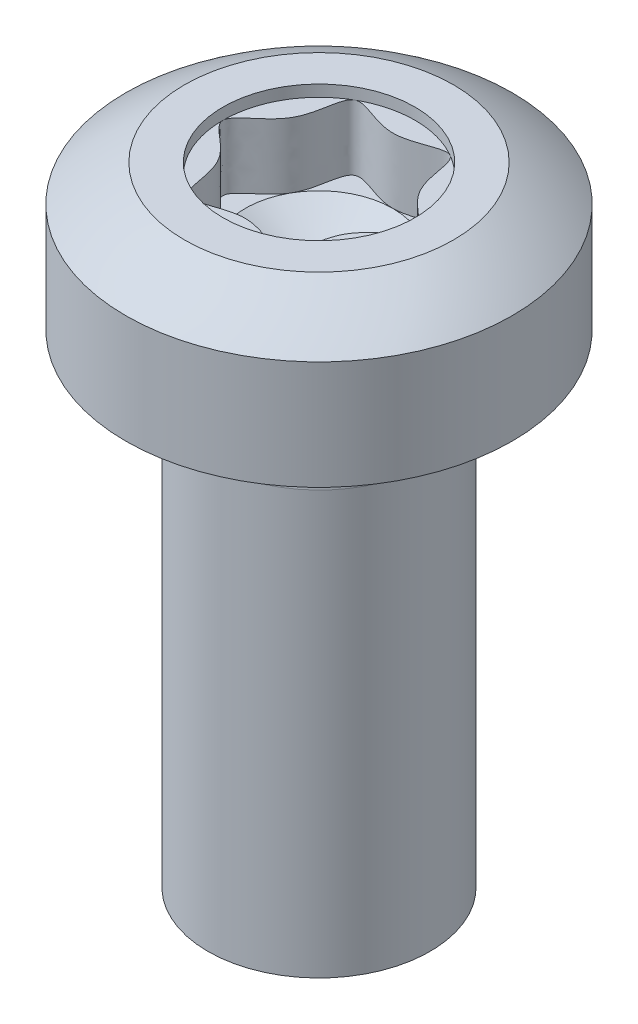
ISO-10303-21;
HEADER;
FILE_DESCRIPTION(('STEP AP214'),'2;1');
FILE_NAME('part.step','',(''),(''),'','','');
FILE_SCHEMA(('AUTOMOTIVE_DESIGN { 1 0 10303 214 1 1 1 1 }'));
ENDSEC;
DATA;
#1=APPLICATION_CONTEXT('core data for automotive mechanical design processes');
#2=APPLICATION_PROTOCOL_DEFINITION('international standard','automotive_design',2000,#1);
#3=PRODUCT_CONTEXT('',#1,'mechanical');
#4=PRODUCT('Part','Part','',(#3));
#5=PRODUCT_RELATED_PRODUCT_CATEGORY('part','',(#4));
#6=PRODUCT_DEFINITION_FORMATION('','',#4);
#7=PRODUCT_DEFINITION_CONTEXT('part definition',#1,'design');
#8=PRODUCT_DEFINITION('design','',#6,#7);
#9=PRODUCT_DEFINITION_SHAPE('','',#8);
#10=(LENGTH_UNIT() NAMED_UNIT(*) SI_UNIT(.MILLI.,.METRE.));
#11=(NAMED_UNIT(*) PLANE_ANGLE_UNIT() SI_UNIT($,.RADIAN.));
#12=(NAMED_UNIT(*) SI_UNIT($,.STERADIAN.) SOLID_ANGLE_UNIT());
#13=UNCERTAINTY_MEASURE_WITH_UNIT(LENGTH_MEASURE(1.E-05),#10,'distance_accuracy_value','');
#14=(GEOMETRIC_REPRESENTATION_CONTEXT(3) GLOBAL_UNCERTAINTY_ASSIGNED_CONTEXT((#13)) GLOBAL_UNIT_ASSIGNED_CONTEXT((#10,
#11,#12)) REPRESENTATION_CONTEXT('',''));
#15=CARTESIAN_POINT('',(0.,0.,0.));
#16=DIRECTION('',(0.,0.,1.));
#17=DIRECTION('',(1.,0.,0.));
#18=AXIS2_PLACEMENT_3D('',#15,#16,#17);
#19=CARTESIAN_POINT('',(0.,0.,0.));
#20=DIRECTION('',(0.,-1.,0.));
#21=DIRECTION('',(0.,0.,-1.));
#22=AXIS2_PLACEMENT_3D('',#19,#20,#21);
#23=CYLINDRICAL_SURFACE('',#22,8.);
#24=CARTESIAN_POINT('',(0.,20.,0.));
#25=DIRECTION('',(0.,-1.,0.));
#26=DIRECTION('',(0.,0.,-1.));
#27=AXIS2_PLACEMENT_3D('',#24,#25,#26);
#28=CIRCLE('',#27,8.);
#29=CARTESIAN_POINT('',(0.,20.,-8.));
#30=VERTEX_POINT('',#29);
#31=EDGE_CURVE('E152',#30,#30,#28,.T.);
#32=ORIENTED_EDGE('',*,*,#31,.F.);
#33=EDGE_LOOP('',(#32));
#34=FACE_BOUND('',#33,.T.);
#35=CARTESIAN_POINT('',(0.,24.5,0.));
#36=DIRECTION('',(0.,-1.,0.));
#37=DIRECTION('',(0.,0.,-1.));
#38=AXIS2_PLACEMENT_3D('',#35,#36,#37);
#39=CIRCLE('',#38,8.);
#40=CARTESIAN_POINT('',(8.,24.5,0.));
#41=VERTEX_POINT('',#40);
#42=EDGE_CURVE('E157',#41,#41,#39,.T.);
#43=ORIENTED_EDGE('',*,*,#42,.T.);
#44=EDGE_LOOP('',(#43));
#45=FACE_BOUND('',#44,.T.);
#46=ADVANCED_FACE('F36',(#34,#45),#23,.T.);
#47=CARTESIAN_POINT('',(4.6,20.,0.));
#48=DIRECTION('',(0.,-1.,0.));
#49=DIRECTION('',(0.,0.,-1.));
#50=AXIS2_PLACEMENT_3D('',#47,#48,#49);
#51=PLANE('',#50);
#52=ORIENTED_EDGE('',*,*,#31,.T.);
#53=EDGE_LOOP('',(#52));
#54=FACE_BOUND('',#53,.T.);
#55=CARTESIAN_POINT('',(0.,20.,0.));
#56=DIRECTION('',(0.,-1.,0.));
#57=DIRECTION('',(0.,0.,-1.));
#58=AXIS2_PLACEMENT_3D('',#55,#56,#57);
#59=CIRCLE('',#58,4.6);
#60=CARTESIAN_POINT('',(0.,20.,-4.6));
#61=VERTEX_POINT('',#60);
#62=EDGE_CURVE('E349',#61,#61,#59,.T.);
#63=ORIENTED_EDGE('',*,*,#62,.F.);
#64=EDGE_LOOP('',(#63));
#65=FACE_BOUND('',#64,.T.);
#66=ADVANCED_FACE('F318',(#54,#65),#51,.T.);
#67=CARTESIAN_POINT('',(0.,14.2530492340404,0.));
#68=DIRECTION('',(0.,-1.,0.));
#69=DIRECTION('',(1.,0.,0.));
#70=AXIS2_PLACEMENT_3D('',#67,#68,#69);
#71=SPHERICAL_SURFACE('',#70,13.);
#72=CARTESIAN_POINT('',(0.,26.,0.));
#73=DIRECTION('',(0.,1.,0.));
#74=DIRECTION('',(0.,0.,1.));
#75=AXIS2_PLACEMENT_3D('',#72,#73,#74);
#76=CIRCLE('',#75,5.56858579013749);
#77=CARTESIAN_POINT('',(5.56858579013749,26.,0.));
#78=VERTEX_POINT('',#77);
#79=EDGE_CURVE('E161',#78,#78,#76,.T.);
#80=CARTESIAN_POINT('',(8.,24.5,0.));
#81=CARTESIAN_POINT('',(7.97649554592093,24.5183504009738,0.));
#82=CARTESIAN_POINT('',(7.95292795153097,24.5366199274566,0.));
#83=CARTESIAN_POINT('',(7.90566760281113,24.5729963723878,0.));
#84=CARTESIAN_POINT('',(7.88197484848123,24.591103290836,0.));
#85=CARTESIAN_POINT('',(7.83446530056333,24.6271536606453,0.));
#86=CARTESIAN_POINT('',(7.81064850697533,24.6450971120062,0.));
#87=CARTESIAN_POINT('',(7.76289200868479,24.6808196983919,0.));
#88=CARTESIAN_POINT('',(7.73895230398225,24.6985988334167,0.));
#89=CARTESIAN_POINT('',(7.69095111700099,24.7339919451095,0.));
#90=CARTESIAN_POINT('',(7.66688963472226,24.7516059217774,0.));
#91=CARTESIAN_POINT('',(7.61864603200755,24.7866678827048,0.));
#92=CARTESIAN_POINT('',(7.59446391157157,24.8041158669641,0.));
#93=CARTESIAN_POINT('',(7.54598017764338,24.8388450168433,0.));
#94=CARTESIAN_POINT('',(7.52167856415117,24.856126182463,0.));
#95=CARTESIAN_POINT('',(7.47295699487816,24.8905208767417,0.));
#96=CARTESIAN_POINT('',(7.44853703909735,24.9076344054007,0.));
#97=CARTESIAN_POINT('',(7.39957994161648,24.9416930153723,0.));
#98=CARTESIAN_POINT('',(7.37504279991643,24.9586380966849,0.));
#99=CARTESIAN_POINT('',(7.32585249251616,24.9923590095554,0.));
#100=CARTESIAN_POINT('',(7.30119932681595,25.0091348411132,0.));
#101=CARTESIAN_POINT('',(7.25177813882847,25.0425164600802,0.));
#102=CARTESIAN_POINT('',(7.22701011654119,25.0591222474893,0.));
#103=CARTESIAN_POINT('',(7.17736038823154,25.092162991817,0.));
#104=CARTESIAN_POINT('',(7.15247868220918,25.1085979487356,0.));
#105=CARTESIAN_POINT('',(7.10260276466465,25.1412962538299,0.));
#106=CARTESIAN_POINT('',(7.07760855314249,25.1575596020056,0.));
#107=CARTESIAN_POINT('',(7.02750880816119,25.1899139194881,0.));
#108=CARTESIAN_POINT('',(7.00240327470206,25.2060048887949,0.));
#109=CARTESIAN_POINT('',(6.95208207468111,25.2380136865762,0.));
#110=CARTESIAN_POINT('',(6.9268664081193,25.2539315150506,0.));
#111=CARTESIAN_POINT('',(6.87632613594249,25.2855932774028,0.));
#112=CARTESIAN_POINT('',(6.85100153032749,25.3013372112805,0.));
#113=CARTESIAN_POINT('',(6.80024457925243,25.332650438909,0.));
#114=CARTESIAN_POINT('',(6.77481223379238,25.3482197326598,0.));
#115=CARTESIAN_POINT('',(6.72384100733719,25.3791829427744,0.));
#116=CARTESIAN_POINT('',(6.69830212634206,25.3945768591382,0.));
#117=CARTESIAN_POINT('',(6.64711903817153,25.4251885855234,0.));
#118=CARTESIAN_POINT('',(6.62147483099614,25.4404063955447,0.));
#119=CARTESIAN_POINT('',(6.57008230480747,25.4706651886286,0.));
#120=CARTESIAN_POINT('',(6.54433398579419,25.4857061716912,0.));
#121=CARTESIAN_POINT('',(6.49273445520218,25.5156105986149,0.));
#122=CARTESIAN_POINT('',(6.46688324362345,25.530474042476,0.));
#123=CARTESIAN_POINT('',(6.41507915204529,25.5600226871608,0.));
#124=CARTESIAN_POINT('',(6.38912627204586,25.5747078879846,0.));
#125=CARTESIAN_POINT('',(6.3371200725854,25.6038993511995,0.));
#126=CARTESIAN_POINT('',(6.31106675312437,25.6184056135907,0.));
#127=CARTESIAN_POINT('',(6.25886090845599,25.6472385130185,0.));
#128=CARTESIAN_POINT('',(6.23270838324865,25.6615651500551,0.));
#129=CARTESIAN_POINT('',(6.18030536550055,25.6900381203575,0.));
#130=CARTESIAN_POINT('',(6.15405487295981,25.7041844536233,0.));
#131=CARTESIAN_POINT('',(6.10145716359734,25.7322961465067,0.));
#132=CARTESIAN_POINT('',(6.07510994677562,25.7462615061244,0.));
#133=CARTESIAN_POINT('',(6.02232003648229,25.7740105904006,0.));
#134=CARTESIAN_POINT('',(5.99587734301068,25.7877943150591,0.));
#135=CARTESIAN_POINT('',(5.94289773157567,25.8151794767194,0.));
#136=CARTESIAN_POINT('',(5.91636081361225,25.8287809137211,0.));
#137=CARTESIAN_POINT('',(5.86319400979179,25.8558008559568,0.));
#138=CARTESIAN_POINT('',(5.83656412393474,25.8692193611908,0.));
#139=CARTESIAN_POINT('',(5.78321264540874,25.895872804611,0.));
#140=CARTESIAN_POINT('',(5.75649105273981,25.9091077427971,0.));
#141=CARTESIAN_POINT('',(5.70295742571127,25.9353934249057,0.));
#142=CARTESIAN_POINT('',(5.67614539135167,25.9484441688281,0.));
#143=CARTESIAN_POINT('',(5.62243215147719,25.9743608462606,0.));
#144=CARTESIAN_POINT('',(5.59553094596231,25.9872267797706,0.));
#145=CARTESIAN_POINT('',(5.56858579013749,26.,0.));
#146=B_SPLINE_CURVE_WITH_KNOTS('',3,(#80,#81,#82,#83,#84,#85,#86,#87,#88,#89,#90,#91,#92,#93,
#94,#95,#96,#97,#98,#99,#100,#101,#102,#103,#104,#105,#106,#107,#108,#109,#110,#111,#112,#113,
#114,#115,#116,#117,#118,#119,#120,#121,#122,#123,#124,#125,#126,#127,#128,#129,#130,#131,#132,
#133,#134,#135,#136,#137,#138,#139,#140,#141,#142,#143,#144,#145),.UNSPECIFIED.,.F.,.F.,(4,2,2,
2,2,2,2,2,2,2,2,2,2,2,2,2,2,2,2,2,2,2,2,2,2,2,2,2,2,2,2,2,4),(0.,0.0894580215008651,
0.178916043001729,0.268374064502595,0.35783208600346,0.447290107504326,0.53674812900519,
0.626206150506057,0.715664172006922,0.805122193507789,0.894580215008655,0.98403823650952,
1.07349625801039,1.16295427951125,1.25241230101212,1.34187032251298,1.43132834401385,
1.52078636551471,1.61024438701558,1.69970240851645,1.78916043001731,1.87861845151818,
1.96807647301904,2.05753449451991,2.14699251602077,2.23645053752164,2.32590855902251,
2.41536658052337,2.50482460202424,2.5942826235251,2.68374064502597,2.77319866652683,
2.8626566880277),.UNSPECIFIED.);
#147=EDGE_CURVE('BSEAM324',#41,#78,#146,.T.);
#148=ORIENTED_EDGE('',*,*,#42,.F.);
#149=ORIENTED_EDGE('',*,*,#79,.F.);
#150=ORIENTED_EDGE('',*,*,#147,.T.);
#151=ORIENTED_EDGE('',*,*,#147,.F.);
#152=EDGE_LOOP('',(#148,#150,#149,#151));
#153=FACE_BOUND('',#152,.T.);
#154=ADVANCED_FACE('F324',(#153),#71,.T.);
#155=CARTESIAN_POINT('',(8.,26.,0.));
#156=DIRECTION('',(0.,1.,0.));
#157=DIRECTION('',(0.,0.,1.));
#158=AXIS2_PLACEMENT_3D('',#155,#156,#157);
#159=PLANE('',#158);
#160=CARTESIAN_POINT('',(0.,26.,0.));
#161=DIRECTION('',(0.,1.,0.));
#162=DIRECTION('',(0.,0.,1.));
#163=AXIS2_PLACEMENT_3D('',#160,#161,#162);
#164=CIRCLE('',#163,3.975);
#165=CARTESIAN_POINT('',(0.,26.,3.975));
#166=VERTEX_POINT('',#165);
#167=EDGE_CURVE('E369',#166,#166,#164,.T.);
#168=ORIENTED_EDGE('',*,*,#167,.F.);
#169=EDGE_LOOP('',(#168));
#170=FACE_BOUND('',#169,.T.);
#171=ORIENTED_EDGE('',*,*,#79,.T.);
#172=EDGE_LOOP('',(#171));
#173=FACE_BOUND('',#172,.T.);
#174=ADVANCED_FACE('F330',(#170,#173),#159,.T.);
#175=CARTESIAN_POINT('',(0.,17.5,0.));
#176=DIRECTION('',(0.,-1.,0.));
#177=DIRECTION('',(0.,0.,-1.));
#178=AXIS2_PLACEMENT_3D('',#175,#176,#177);
#179=CONICAL_SURFACE('',#178,4.6,0.104396870067181);
#180=CARTESIAN_POINT('',(0.,19.6,0.));
#181=DIRECTION('',(0.,-1.,0.));
#182=DIRECTION('',(0.,0.,-1.));
#183=AXIS2_PLACEMENT_3D('',#180,#181,#182);
#184=CIRCLE('',#183,4.37996663175755);
#185=CARTESIAN_POINT('',(0.,19.6,-4.37996663175755));
#186=VERTEX_POINT('',#185);
#187=EDGE_CURVE('E346',#186,#186,#184,.T.);
#188=ORIENTED_EDGE('',*,*,#187,.T.);
#189=EDGE_LOOP('',(#188));
#190=FACE_BOUND('',#189,.T.);
#191=CARTESIAN_POINT('',(0.,17.5,0.));
#192=DIRECTION('',(0.,-1.,0.));
#193=DIRECTION('',(0.,0.,-1.));
#194=AXIS2_PLACEMENT_3D('',#191,#192,#193);
#195=CIRCLE('',#194,4.6);
#196=CARTESIAN_POINT('',(0.,17.5,-4.6));
#197=VERTEX_POINT('',#196);
#198=EDGE_CURVE('E164',#197,#197,#195,.T.);
#199=ORIENTED_EDGE('',*,*,#198,.F.);
#200=EDGE_LOOP('',(#199));
#201=FACE_BOUND('',#200,.T.);
#202=ADVANCED_FACE('F360',(#190,#201),#179,.T.);
#203=CARTESIAN_POINT('',(0.,19.641682936628,0.));
#204=DIRECTION('',(0.,-1.,0.));
#205=DIRECTION('',(0.,0.,-1.));
#206=AXIS2_PLACEMENT_3D('',#203,#204,#205);
#207=TOROIDAL_SURFACE('',#206,4.77778886943923,0.399999999999999);
#208=ORIENTED_EDGE('',*,*,#62,.T.);
#209=EDGE_LOOP('',(#208));
#210=FACE_BOUND('',#209,.T.);
#211=ORIENTED_EDGE('',*,*,#187,.F.);
#212=EDGE_LOOP('',(#211));
#213=FACE_BOUND('',#212,.T.);
#214=ADVANCED_FACE('F341',(#210,#213),#207,.F.);
#215=CARTESIAN_POINT('',(0.,0.,0.));
#216=DIRECTION('',(0.,-1.,0.));
#217=DIRECTION('',(0.,0.,-1.));
#218=AXIS2_PLACEMENT_3D('',#215,#216,#217);
#219=PLANE('',#218);
#220=CARTESIAN_POINT('',(0.,0.,0.));
#221=DIRECTION('',(0.,-1.,0.));
#222=DIRECTION('',(0.,0.,-1.));
#223=AXIS2_PLACEMENT_3D('',#220,#221,#222);
#224=CIRCLE('',#223,4.6);
#225=CARTESIAN_POINT('',(0.,0.,-4.6));
#226=VERTEX_POINT('',#225);
#227=EDGE_CURVE('E147',#226,#226,#224,.T.);
#228=ORIENTED_EDGE('',*,*,#227,.T.);
#229=EDGE_LOOP('',(#228));
#230=FACE_BOUND('',#229,.T.);
#231=ADVANCED_FACE('F38',(#230),#219,.T.);
#232=CARTESIAN_POINT('',(0.,0.,0.));
#233=DIRECTION('',(0.,-1.,0.));
#234=DIRECTION('',(0.,0.,-1.));
#235=AXIS2_PLACEMENT_3D('',#232,#233,#234);
#236=CYLINDRICAL_SURFACE('',#235,4.6);
#237=ORIENTED_EDGE('',*,*,#227,.F.);
#238=EDGE_LOOP('',(#237));
#239=FACE_BOUND('',#238,.T.);
#240=ORIENTED_EDGE('',*,*,#198,.T.);
#241=EDGE_LOOP('',(#240));
#242=FACE_BOUND('',#241,.T.);
#243=ADVANCED_FACE('F332',(#239,#242),#236,.T.);
#244=CARTESIAN_POINT('',(0.,25.523,0.));
#245=DIRECTION('',(0.,1.,0.));
#246=DIRECTION('',(0.,0.,1.));
#247=AXIS2_PLACEMENT_3D('',#244,#245,#246);
#248=CYLINDRICAL_SURFACE('',#247,3.975);
#249=ORIENTED_EDGE('',*,*,#167,.T.);
#250=EDGE_LOOP('',(#249));
#251=FACE_BOUND('',#250,.T.);
#252=CARTESIAN_POINT('',(0.,25.523,0.));
#253=DIRECTION('',(0.,1.,0.));
#254=DIRECTION('',(0.,0.,1.));
#255=AXIS2_PLACEMENT_3D('',#252,#253,#254);
#256=CIRCLE('',#255,3.975);
#257=CARTESIAN_POINT('',(-1.98749999999998,25.523,3.44245098004315));
#258=VERTEX_POINT('',#257);
#259=CARTESIAN_POINT('',(1.98750000000002,25.523,3.44245098004313));
#260=VERTEX_POINT('',#259);
#261=EDGE_CURVE('E128',#258,#260,#256,.T.);
#262=ORIENTED_EDGE('',*,*,#261,.F.);
#263=CARTESIAN_POINT('',(-3.975,25.523,0.));
#264=VERTEX_POINT('',#263);
#265=EDGE_CURVE('E370',#264,#258,#256,.T.);
#266=ORIENTED_EDGE('',*,*,#265,.F.);
#267=CARTESIAN_POINT('',(-1.98750000000002,25.523,-3.44245098004313));
#268=VERTEX_POINT('',#267);
#269=EDGE_CURVE('E372',#268,#264,#256,.T.);
#270=ORIENTED_EDGE('',*,*,#269,.F.);
#271=CARTESIAN_POINT('',(1.98749999999998,25.523,-3.44245098004315));
#272=VERTEX_POINT('',#271);
#273=EDGE_CURVE('E121',#272,#268,#256,.T.);
#274=ORIENTED_EDGE('',*,*,#273,.F.);
#275=CARTESIAN_POINT('',(3.975,25.523,0.));
#276=VERTEX_POINT('',#275);
#277=EDGE_CURVE('E111',#276,#272,#256,.T.);
#278=ORIENTED_EDGE('',*,*,#277,.F.);
#279=EDGE_CURVE('E54',#260,#276,#256,.T.);
#280=ORIENTED_EDGE('',*,*,#279,.F.);
#281=EDGE_LOOP('',(#262,#266,#270,#274,#278,#280));
#282=FACE_BOUND('',#281,.T.);
#283=ADVANCED_FACE('F118',(#251,#282),#248,.F.);
#284=CARTESIAN_POINT('',(0.,25.523,0.));
#285=DIRECTION('',(0.,1.,0.));
#286=DIRECTION('',(0.,0.,1.));
#287=AXIS2_PLACEMENT_3D('',#284,#285,#286);
#288=PLANE('',#287);
#289=CARTESIAN_POINT('',(0.,25.523,3.05769230769231));
#290=CARTESIAN_POINT('',(0.815686274551115,25.523,3.0576923076923));
#291=CARTESIAN_POINT('',(2.44705882365334,25.523,4.23843021167727));
#292=CARTESIAN_POINT('',(2.13676470538672,25.523,1.2336616778499));
#293=CARTESIAN_POINT('',(4.89411764730665,25.523,0.));
#294=CARTESIAN_POINT('',(2.13676470538671,25.523,-1.23366167784992));
#295=CARTESIAN_POINT('',(2.4470588236533,25.523,-4.2384302116773));
#296=CARTESIAN_POINT('',(0.,25.523,-2.46732335569982));
#297=CARTESIAN_POINT('',(-2.44705882365334,25.523,-4.23843021167727));
#298=CARTESIAN_POINT('',(-2.13676470538671,25.523,-1.23366167784991));
#299=CARTESIAN_POINT('',(-4.89411764730665,25.523,0.));
#300=CARTESIAN_POINT('',(-2.13676470538671,25.523,1.23366167784992));
#301=CARTESIAN_POINT('',(-2.4470588236533,25.523,4.2384302116773));
#302=CARTESIAN_POINT('',(-0.815686274551101,25.523,3.05769230769231));
#303=CARTESIAN_POINT('',(0.,25.523,3.05769230769231));
#304=B_SPLINE_CURVE_WITH_KNOTS('',3,(#289,#290,#291,#292,#293,#294,#295,#296,#297,#298,#299,
#300,#301,#302,#303),.UNSPECIFIED.,.T.,.F.,(4,1,1,1,1,1,1,1,1,1,1,1,4),(0.,0.0833333333333341,
0.166666666666667,0.250000000000001,0.333333333333333,0.416666666666667,0.5,0.583333333333334,
0.666666666666667,0.750000000000001,0.833333333333333,0.916666666666667,1.),.UNSPECIFIED.);
#305=EDGE_CURVE('E11',#258,#264,#304,.F.);
#306=ORIENTED_EDGE('',*,*,#305,.T.);
#307=ORIENTED_EDGE('',*,*,#265,.T.);
#308=EDGE_LOOP('',(#306,#307));
#309=FACE_BOUND('',#308,.T.);
#310=ADVANCED_FACE('F339',(#309),#288,.T.);
#311=EDGE_CURVE('E47',#264,#268,#304,.F.);
#312=ORIENTED_EDGE('',*,*,#311,.T.);
#313=ORIENTED_EDGE('',*,*,#269,.T.);
#314=EDGE_LOOP('',(#312,#313));
#315=FACE_BOUND('',#314,.T.);
#316=ADVANCED_FACE('F380',(#315),#288,.T.);
#317=EDGE_CURVE('E115',#268,#272,#304,.F.);
#318=ORIENTED_EDGE('',*,*,#317,.T.);
#319=ORIENTED_EDGE('',*,*,#273,.T.);
#320=EDGE_LOOP('',(#318,#319));
#321=FACE_BOUND('',#320,.T.);
#322=ADVANCED_FACE('F379',(#321),#288,.T.);
#323=EDGE_CURVE('E109',#272,#276,#304,.F.);
#324=ORIENTED_EDGE('',*,*,#323,.T.);
#325=ORIENTED_EDGE('',*,*,#277,.T.);
#326=EDGE_LOOP('',(#324,#325));
#327=FACE_BOUND('',#326,.T.);
#328=ADVANCED_FACE('F110',(#327),#288,.T.);
#329=EDGE_CURVE('E116',#276,#260,#304,.F.);
#330=ORIENTED_EDGE('',*,*,#329,.T.);
#331=ORIENTED_EDGE('',*,*,#279,.T.);
#332=EDGE_LOOP('',(#330,#331));
#333=FACE_BOUND('',#332,.T.);
#334=ADVANCED_FACE('F125',(#333),#288,.T.);
#335=EDGE_CURVE('E40',#260,#258,#304,.F.);
#336=ORIENTED_EDGE('',*,*,#335,.T.);
#337=ORIENTED_EDGE('',*,*,#261,.T.);
#338=EDGE_LOOP('',(#336,#337));
#339=FACE_BOUND('',#338,.T.);
#340=ADVANCED_FACE('F387',(#339),#288,.T.);
#341=CARTESIAN_POINT('',(0.,22.82,0.));
#342=DIRECTION('',(0.,1.,0.));
#343=DIRECTION('',(0.,0.,1.));
#344=AXIS2_PLACEMENT_3D('',#341,#342,#343);
#345=PLANE('',#344);
#346=CARTESIAN_POINT('',(0.,22.82,0.));
#347=DIRECTION('',(0.,1.,0.));
#348=DIRECTION('',(0.881549013507512,0.,0.472092508714057));
#349=AXIS2_PLACEMENT_3D('',#346,#347,#348);
#350=CIRCLE('',#349,3.05769230769231);
#351=CARTESIAN_POINT('',(2.69787028997874,22.82,1.44503035522741));
#352=VERTEX_POINT('',#351);
#353=CARTESIAN_POINT('',(2.66196984233389,22.82,-1.50636268887187));
#354=VERTEX_POINT('',#353);
#355=EDGE_CURVE('E141',#352,#354,#350,.T.);
#356=ORIENTED_EDGE('',*,*,#355,.F.);
#357=CARTESIAN_POINT('',(2.66143561437564,22.82,-1.50605289266838));
#358=CARTESIAN_POINT('',(3.07563558349557,22.82,-0.813555364317623));
#359=CARTESIAN_POINT('',(4.84797612069008,22.82,-0.0119352840856501));
#360=CARTESIAN_POINT('',(3.127637914832,22.82,0.789684796146351));
#361=CARTESIAN_POINT('',(2.69911285713381,22.82,1.44582778906239));
#362=B_SPLINE_CURVE_WITH_KNOTS('',3,(#357,#358,#359,#360,#361),.UNSPECIFIED.,.F.,.F.,(4,1,4),
(0.169985680603832,0.252418670430459,0.332432989826627),.UNSPECIFIED.);
#363=EDGE_CURVE('E285',#352,#354,#362,.F.);
#364=ORIENTED_EDGE('',*,*,#363,.T.);
#365=EDGE_LOOP('',(#356,#364));
#366=FACE_BOUND('',#365,.T.);
#367=ADVANCED_FACE('F185',(#366),#345,.T.);
#368=CARTESIAN_POINT('',(-0.000781045270946759,22.82,-3.05769182891709));
#369=CARTESIAN_POINT('',(0.803471751431939,22.82,-3.05790406492198));
#370=CARTESIAN_POINT('',(1.50552662167113,22.82,-2.66182162507648));
#371=CARTESIAN_POINT('',(2.20446517718511,22.82,-2.26749733490277));
#372=CARTESIAN_POINT('',(2.61945189050329,22.82,-1.57834900704314));
#373=B_SPLINE_CURVE_WITH_KNOTS('',2,(#368,#369,#370,#371,#372),.UNSPECIFIED.,.F.,.F.,(3,2,3),
(0.,0.5,1.),.UNSPECIFIED.);
#374=CARTESIAN_POINT('',(0.000742424595345002,22.82,-3.05769240122321));
#375=VERTEX_POINT('',#374);
#376=CARTESIAN_POINT('',(2.61790523262918,22.82,-1.58319739929965));
#377=VERTEX_POINT('',#376);
#378=EDGE_CURVE('E127',#375,#377,#373,.T.);
#379=ORIENTED_EDGE('',*,*,#378,.T.);
#380=CARTESIAN_POINT('',(0.000155057807458628,22.82,-3.05769231480316));
#381=CARTESIAN_POINT('',(0.815789644577634,22.82,-3.05776712191756));
#382=CARTESIAN_POINT('',(2.4245783828942,22.82,-4.22210163825064));
#383=CARTESIAN_POINT('',(2.24554690407833,22.82,-2.28984070371147));
#384=CARTESIAN_POINT('',(2.61547131244174,22.82,-1.58788657339917));
#385=B_SPLINE_CURVE_WITH_KNOTS('',3,(#380,#381,#382,#383,#384),.UNSPECIFIED.,.F.,.F.,(4,1,4),
(0.335629425376625,0.418957478295838,0.49999471958588),.UNSPECIFIED.);
#386=EDGE_CURVE('E282',#377,#375,#385,.F.);
#387=ORIENTED_EDGE('',*,*,#386,.T.);
#388=EDGE_LOOP('',(#379,#387));
#389=FACE_BOUND('',#388,.T.);
#390=ADVANCED_FACE('F174',(#389),#345,.T.);
#391=CARTESIAN_POINT('',(0.,22.82,0.));
#392=DIRECTION('',(0.,1.,0.));
#393=DIRECTION('',(0.000242805543424307,0.,-0.999999970522734));
#394=AXIS2_PLACEMENT_3D('',#391,#392,#393);
#395=CIRCLE('',#394,3.05769230769231);
#396=CARTESIAN_POINT('',(-2.66629658817147,22.82,-1.49898600467109));
#397=VERTEX_POINT('',#396);
#398=EDGE_CURVE('E144',#375,#397,#395,.T.);
#399=ORIENTED_EDGE('',*,*,#398,.F.);
#400=CARTESIAN_POINT('',(-2.66588064145487,22.82,-1.49866293028352));
#401=CARTESIAN_POINT('',(-2.65983134375439,22.82,-1.50866398460531));
#402=CARTESIAN_POINT('',(-2.23871411155985,22.82,-2.22090039646527));
#403=CARTESIAN_POINT('',(-2.44705882365334,22.82,-4.23843021167727));
#404=CARTESIAN_POINT('',(-0.815634588615256,22.82,-3.0576548989817));
#405=CARTESIAN_POINT('',(0.000103371871717009,22.82,-3.05769231006271));
#406=CARTESIAN_POINT('',(0.000155057807458682,22.82,-3.05769231480316));
#407=B_SPLINE_CURVE_WITH_KNOTS('',3,(#400,#401,#402,#403,#404,#405,#406),.UNSPECIFIED.,.F.,.F.,
(4,1,1,1,4),(0.49999471958588,0.501188721095386,0.584522054428719,0.667855387762053,
0.667860668176173),.UNSPECIFIED.);
#408=EDGE_CURVE('E284',#375,#397,#407,.F.);
#409=ORIENTED_EDGE('',*,*,#408,.T.);
#410=EDGE_LOOP('',(#399,#409));
#411=FACE_BOUND('',#410,.T.);
#412=ADVANCED_FACE('F184',(#411),#345,.T.);
#413=CARTESIAN_POINT('',(0.,22.82,0.));
#414=DIRECTION('',(0.,1.,0.));
#415=DIRECTION('',(-0.881552782837556,0.,-0.472085470091339));
#416=AXIS2_PLACEMENT_3D('',#413,#414,#415);
#417=CIRCLE('',#416,3.05769230769231);
#418=CARTESIAN_POINT('',(-2.69788261585195,22.82,-1.44500938708784));
#419=VERTEX_POINT('',#418);
#420=CARTESIAN_POINT('',(-2.66196984233368,22.82,1.50636268887227));
#421=VERTEX_POINT('',#420);
#422=EDGE_CURVE('E131',#419,#421,#417,.T.);
#423=ORIENTED_EDGE('',*,*,#422,.F.);
#424=CARTESIAN_POINT('',(-2.66143561437541,22.82,1.50605289266877));
#425=CARTESIAN_POINT('',(-3.07563558349524,22.82,0.813555364317773));
#426=CARTESIAN_POINT('',(-4.84796710262063,22.82,0.0119393629100453));
#427=CARTESIAN_POINT('',(-3.12765542168154,22.82,-0.789676638497712));
#428=CARTESIAN_POINT('',(-2.69912613759267,22.82,-1.44580745476446));
#429=B_SPLINE_CURVE_WITH_KNOTS('',3,(#424,#425,#426,#427,#428),.UNSPECIFIED.,.F.,.F.,(4,1,4),
(0.669986507172492,0.752419496999134,0.832432989826642),.UNSPECIFIED.);
#430=EDGE_CURVE('E236',#419,#421,#429,.F.);
#431=ORIENTED_EDGE('',*,*,#430,.T.);
#432=EDGE_LOOP('',(#423,#431));
#433=FACE_BOUND('',#432,.T.);
#434=ADVANCED_FACE('F187',(#433),#345,.T.);
#435=CARTESIAN_POINT('',(0.,22.82,0.));
#436=DIRECTION('',(0.,1.,0.));
#437=DIRECTION('',(-0.85652807828879,0.,0.516100427342308));
#438=AXIS2_PLACEMENT_3D('',#435,#436,#437);
#439=CIRCLE('',#438,3.05769230769231);
#440=CARTESIAN_POINT('',(-2.61790523262929,22.82,1.58319739929956));
#441=VERTEX_POINT('',#440);
#442=CARTESIAN_POINT('',(-0.00117797009561427,22.82,3.05769193721608));
#443=VERTEX_POINT('',#442);
#444=EDGE_CURVE('E133',#441,#443,#439,.T.);
#445=ORIENTED_EDGE('',*,*,#444,.F.);
#446=CARTESIAN_POINT('',(-0.000696589999965553,22.82,3.05769245117967));
#447=CARTESIAN_POINT('',(-0.816150630651726,22.82,3.05802835698667));
#448=CARTESIAN_POINT('',(-2.42455829576315,22.82,4.22188484074321));
#449=CARTESIAN_POINT('',(-2.24554690407836,22.82,2.2898407037118));
#450=CARTESIAN_POINT('',(-2.61547131244155,22.82,1.58788657339953));
#451=B_SPLINE_CURVE_WITH_KNOTS('',3,(#446,#447,#448,#449,#450),.UNSPECIFIED.,.F.,.F.,(4,1,4),
(0.835629425376639,0.918939036694388,0.999976277984417),.UNSPECIFIED.);
#452=EDGE_CURVE('E278',#441,#443,#451,.F.);
#453=ORIENTED_EDGE('',*,*,#452,.T.);
#454=EDGE_LOOP('',(#445,#453));
#455=FACE_BOUND('',#454,.T.);
#456=ADVANCED_FACE('F310',(#455),#345,.T.);
#457=CARTESIAN_POINT('',(0.,22.82,0.));
#458=DIRECTION('',(0.,1.,0.));
#459=DIRECTION('',(-0.000500092387032876,0.,0.999999874953794));
#460=AXIS2_PLACEMENT_3D('',#457,#458,#459);
#461=CIRCLE('',#460,3.05769230769231);
#462=CARTESIAN_POINT('',(2.66629658817212,22.82,1.49898600466997));
#463=VERTEX_POINT('',#462);
#464=EDGE_CURVE('E137',#443,#463,#461,.T.);
#465=ORIENTED_EDGE('',*,*,#464,.F.);
#466=CARTESIAN_POINT('',(2.66588064145554,22.82,1.49866293028242));
#467=CARTESIAN_POINT('',(2.65257881426324,22.82,1.52062888675423));
#468=CARTESIAN_POINT('',(2.6397944984259,22.82,1.54290344241547));
#469=CARTESIAN_POINT('',(2.61520333180059,22.82,1.58799888177524));
#470=CARTESIAN_POINT('',(2.60339690455447,22.82,1.61081999673921));
#471=CARTESIAN_POINT('',(2.58070475018237,22.82,1.65694011987156));
#472=CARTESIAN_POINT('',(2.56981989229127,22.82,1.68023955402305));
#473=CARTESIAN_POINT('',(2.54890867937523,22.82,1.72724828667577));
#474=CARTESIAN_POINT('',(2.53888322167125,22.82,1.75095798324126));
#475=CARTESIAN_POINT('',(2.51963049381765,22.82,1.79871950457272));
#476=CARTESIAN_POINT('',(2.51040384230052,22.82,1.82277157800007));
#477=CARTESIAN_POINT('',(2.49268866142112,22.82,1.8711496597128));
#478=CARTESIAN_POINT('',(2.48420026556401,22.82,1.89547571665032));
#479=CARTESIAN_POINT('',(2.45976926665789,22.82,1.96870908954375));
#480=CARTESIAN_POINT('',(2.44482901605499,22.82,2.01795204979307));
#481=CARTESIAN_POINT('',(2.41718649898967,22.82,2.11670974792644));
#482=CARTESIAN_POINT('',(2.40447052641215,22.82,2.1662207316589));
#483=CARTESIAN_POINT('',(2.38079308566247,22.82,2.26497978226022));
#484=CARTESIAN_POINT('',(2.36981106145797,22.82,2.31422297386032));
#485=CARTESIAN_POINT('',(2.33922116273497,22.82,2.458792542439));
#486=CARTESIAN_POINT('',(2.32108063591573,22.82,2.55442041179442));
#487=CARTESIAN_POINT('',(2.29422559817574,22.82,2.69522290766321));
#488=CARTESIAN_POINT('',(2.28558375085939,22.82,2.74041725256849));
#489=CARTESIAN_POINT('',(2.26808402976575,22.82,2.82836984129751));
#490=CARTESIAN_POINT('',(2.25925973540073,22.82,2.8711346080226));
#491=CARTESIAN_POINT('',(2.24088081543894,22.82,2.95368795156459));
#492=CARTESIAN_POINT('',(2.23140756283892,22.82,2.99349385069567));
#493=CARTESIAN_POINT('',(2.21592640419311,22.82,3.05168452734812));
#494=CARTESIAN_POINT('',(2.21072952091913,22.82,3.0702832463337));
#495=CARTESIAN_POINT('',(2.19996015494492,22.82,3.10652649722153));
#496=CARTESIAN_POINT('',(2.19441255161455,22.82,3.12417834400566));
#497=CARTESIAN_POINT('',(2.1828766281647,22.82,3.15845751198815));
#498=CARTESIAN_POINT('',(2.17691936242798,22.82,3.17509519890933));
#499=CARTESIAN_POINT('',(2.16449575336198,22.82,3.20727700345755));
#500=CARTESIAN_POINT('',(2.15806717757043,22.82,3.22283546077913));
#501=CARTESIAN_POINT('',(2.14786487113159,22.82,3.24557842793336));
#502=CARTESIAN_POINT('',(2.14444324984577,22.82,3.25292133576764));
#503=CARTESIAN_POINT('',(2.13745288569777,22.82,3.26730781365564));
#504=CARTESIAN_POINT('',(2.13389007340089,22.82,3.27435425269831));
#505=CARTESIAN_POINT('',(2.12660962241539,22.82,3.2881388239762));
#506=CARTESIAN_POINT('',(2.12289821937028,22.82,3.29488024046178));
#507=CARTESIAN_POINT('',(2.11531263053085,22.82,3.3080458756734));
#508=CARTESIAN_POINT('',(2.11144490850494,22.82,3.31447380640597));
#509=CARTESIAN_POINT('',(2.10353891066774,22.82,3.3270035301492));
#510=CARTESIAN_POINT('',(2.09950720714403,22.82,3.33310945714416));
#511=CARTESIAN_POINT('',(2.09126553877606,22.82,3.34498629463607));
#512=CARTESIAN_POINT('',(2.0870621032571,22.82,3.35076172024211));
#513=CARTESIAN_POINT('',(2.07846959404286,22.82,3.36196857118105));
#514=CARTESIAN_POINT('',(2.0740868141008,22.82,3.3674048102152));
#515=CARTESIAN_POINT('',(2.0651278705643,22.82,3.37792494829296));
#516=CARTESIAN_POINT('',(2.06055755782407,22.82,3.38301380111247));
#517=CARTESIAN_POINT('',(2.05352149839804,22.82,3.39040828767124));
#518=CARTESIAN_POINT('',(2.05116344940469,22.82,3.39281700565971));
#519=CARTESIAN_POINT('',(2.04639719221532,22.82,3.39754371996892));
#520=CARTESIAN_POINT('',(2.0439895737966,22.82,3.39986230954154));
#521=CARTESIAN_POINT('',(2.03912335712335,22.82,3.40440764046353));
#522=CARTESIAN_POINT('',(2.03666528678314,22.82,3.40663494684386));
#523=CARTESIAN_POINT('',(2.03169726523512,22.82,3.41099670239071));
#524=CARTESIAN_POINT('',(2.02918777443733,22.82,3.4131316755449));
#525=CARTESIAN_POINT('',(2.02411604015571,22.82,3.41730773939989));
#526=CARTESIAN_POINT('',(2.02155418399263,22.82,3.41934930020542));
#527=CARTESIAN_POINT('',(2.01637684719878,22.82,3.42333753604166));
#528=CARTESIAN_POINT('',(2.01376167662188,22.82,3.42528461332643));
#529=CARTESIAN_POINT('',(2.00847684165819,22.82,3.42908288639308));
#530=CARTESIAN_POINT('',(2.00580740733136,22.82,3.43093440210267));
#531=CARTESIAN_POINT('',(2.00041318939679,22.82,3.43454058797547));
#532=CARTESIAN_POINT('',(1.99768855481196,22.82,3.43629548094607));
#533=CARTESIAN_POINT('',(1.99218303756204,22.82,3.43970741005491));
#534=CARTESIAN_POINT('',(1.98940222385636,22.82,3.44136455741369));
#535=CARTESIAN_POINT('',(1.98378362587761,22.82,3.44458022473731));
#536=CARTESIAN_POINT('',(1.98094583359897,22.82,3.44613873071337));
#537=CARTESIAN_POINT('',(1.97521390162536,22.82,3.44915872133291));
#538=CARTESIAN_POINT('',(1.97231968680182,22.82,3.45062006330208));
#539=CARTESIAN_POINT('',(1.96647539658634,22.82,3.45344717121552));
#540=CARTESIAN_POINT('',(1.96352519225114,22.82,3.45481267045767));
#541=CARTESIAN_POINT('',(1.95756942780147,22.82,3.45744957552794));
#542=CARTESIAN_POINT('',(1.95456369791183,22.82,3.45872059762144));
#543=CARTESIAN_POINT('',(1.94849736628618,22.82,3.46117001190456));
#544=CARTESIAN_POINT('',(1.94543656597121,22.82,3.46234791186421));
#545=CARTESIAN_POINT('',(1.93926056526938,22.82,3.4646125398493));
#546=CARTESIAN_POINT('',(1.93614514843475,22.82,3.46569867702796));
#547=CARTESIAN_POINT('',(1.92986038431356,22.82,3.46778122484934));
#548=CARTESIAN_POINT('',(1.9266908124264,22.82,3.46877695678145));
#549=CARTESIAN_POINT('',(1.92029816367392,22.82,3.47068013450186));
#550=CARTESIAN_POINT('',(1.91707486208201,22.82,3.47158682506094));
#551=CARTESIAN_POINT('',(1.91057530299738,22.82,3.4733133272057));
#552=CARTESIAN_POINT('',(1.90729882864193,22.82,3.47413231835292));
#553=CARTESIAN_POINT('',(1.89734195792658,22.82,3.47647249072406));
#554=CARTESIAN_POINT('',(1.89062719421735,22.82,3.47784933774015));
#555=CARTESIAN_POINT('',(1.87699230151328,22.82,3.48027571712772));
#556=CARTESIAN_POINT('',(1.87007084379352,22.82,3.48131765717932));
#557=CARTESIAN_POINT('',(1.85602522371879,22.82,3.48308568563563));
#558=CARTESIAN_POINT('',(1.84890007957439,22.82,3.48380389917093));
#559=CARTESIAN_POINT('',(1.83445042105662,22.82,3.48493543800122));
#560=CARTESIAN_POINT('',(1.82712530059504,22.82,3.48534085876193));
#561=CARTESIAN_POINT('',(1.81227882806051,22.82,3.48585759275874));
#562=CARTESIAN_POINT('',(1.80475721783567,22.82,3.48596117364384));
#563=CARTESIAN_POINT('',(1.78952098982601,22.82,3.48588481453262));
#564=CARTESIAN_POINT('',(1.78180641933512,22.82,3.48569746095386));
#565=CARTESIAN_POINT('',(1.76618754322868,22.82,3.48504968178148));
#566=CARTESIAN_POINT('',(1.75828353683934,22.82,3.48458226149694));
#567=CARTESIAN_POINT('',(1.74228907247666,22.82,3.48338475801019));
#568=CARTESIAN_POINT('',(1.73419910907615,22.82,3.48264816239146));
#569=CARTESIAN_POINT('',(1.71783626682534,22.82,3.4809224822302));
#570=CARTESIAN_POINT('',(1.70956403051403,22.82,3.47992739512014));
#571=CARTESIAN_POINT('',(1.6841655092896,22.82,3.47653810604408));
#572=CARTESIAN_POINT('',(1.66708609539928,22.82,3.47379024840188));
#573=CARTESIAN_POINT('',(1.63223643474615,22.82,3.46743036929972));
#574=CARTESIAN_POINT('',(1.6144728375894,22.82,3.46378291195478));
#575=CARTESIAN_POINT('',(1.57828174178967,22.82,3.45570039155073));
#576=CARTESIAN_POINT('',(1.55986060819856,22.82,3.45123714101151));
#577=CARTESIAN_POINT('',(1.50252987798334,22.82,3.43650885312888));
#578=CARTESIAN_POINT('',(1.46384991803468,22.82,3.42535850969227));
#579=CARTESIAN_POINT('',(1.38417345224153,22.82,3.40095864590223));
#580=CARTESIAN_POINT('',(1.34320632817609,22.82,3.38761647847982));
#581=CARTESIAN_POINT('',(1.25919429940828,22.82,3.35944807358054));
#582=CARTESIAN_POINT('',(1.21616342170759,22.82,3.34458058445769));
#583=CARTESIAN_POINT('',(1.08186728462205,22.82,3.29790976844154));
#584=CARTESIAN_POINT('',(0.990693501343505,22.82,3.26583432578402));
#585=CARTESIAN_POINT('',(0.851237544185901,22.82,3.21968691554823));
#586=CARTESIAN_POINT('',(0.803377334417303,22.82,3.2043644639094));
#587=CARTESIAN_POINT('',(0.70651390177623,22.82,3.17491220171251));
#588=CARTESIAN_POINT('',(0.657504242035227,22.82,3.16080337691984));
#589=CARTESIAN_POINT('',(0.558615394402422,22.82,3.13449182597793));
#590=CARTESIAN_POINT('',(0.50873259227177,22.82,3.12230239168538));
#591=CARTESIAN_POINT('',(0.43342415240646,22.82,3.10596488845187));
#592=CARTESIAN_POINT('',(0.408209744567055,22.82,3.1008384621177));
#593=CARTESIAN_POINT('',(0.357636656816524,22.82,3.09132126740798));
#594=CARTESIAN_POINT('',(0.332277951949809,22.82,3.08693063054569));
#595=CARTESIAN_POINT('',(0.281445077955572,22.82,3.07897181145316));
#596=CARTESIAN_POINT('',(0.2559709785537,22.82,3.07540318649021));
#597=CARTESIAN_POINT('',(0.204935330120069,22.82,3.06917518837645));
#598=CARTESIAN_POINT('',(0.17937388756123,22.82,3.06651495196552));
#599=CARTESIAN_POINT('',(0.128192673898091,22.82,3.0621903266308));
#600=CARTESIAN_POINT('',(0.102572989221973,22.82,3.06052492167377));
#601=CARTESIAN_POINT('',(0.0513011206375839,22.82,3.05827629621041));
#602=CARTESIAN_POINT('',(0.0256489727292413,22.82,3.05769230802663));
#603=CARTESIAN_POINT('',(-5.80491771632559E-05,22.82,3.05769230769155));
#604=CARTESIAN_POINT('',(-0.000116098338062555,22.82,3.05769231068207));
#605=CARTESIAN_POINT('',(-0.000232196667174266,22.82,3.05769232264147));
#606=CARTESIAN_POINT('',(-0.000290245835386677,22.82,3.05769233161035));
#607=CARTESIAN_POINT('',(-0.000464393342937983,22.82,3.05769236748374));
#608=CARTESIAN_POINT('',(-0.000580491683354193,22.82,3.05769240335497));
#609=CARTESIAN_POINT('',(-0.000696589999965553,22.82,3.05769245117967));
#610=B_SPLINE_CURVE_WITH_KNOTS('',3,(#466,#467,#468,#469,#470,#471,#472,#473,#474,#475,#476,
#477,#478,#479,#480,#481,#482,#483,#484,#485,#486,#487,#488,#489,#490,#491,#492,#493,#494,#495,
#496,#497,#498,#499,#500,#501,#502,#503,#504,#505,#506,#507,#508,#509,#510,#511,#512,#513,#514,
#515,#516,#517,#518,#519,#520,#521,#522,#523,#524,#525,#526,#527,#528,#529,#530,#531,#532,#533,
#534,#535,#536,#537,#538,#539,#540,#541,#542,#543,#544,#545,#546,#547,#548,#549,#550,#551,#552,
#553,#554,#555,#556,#557,#558,#559,#560,#561,#562,#563,#564,#565,#566,#567,#568,#569,#570,#571,
#572,#573,#574,#575,#576,#577,#578,#579,#580,#581,#582,#583,#584,#585,#586,#587,#588,#589,#590,
#591,#592,#593,#594,#595,#596,#597,#598,#599,#600,#601,#602,#603,#604,#605,#606,#607,#608,#609),
.UNSPECIFIED.,.F.,.F.,(4,2,2,2,2,2,2,2,2,2,2,2,2,2,2,2,2,2,2,2,2,2,2,2,2,2,2,2,2,2,2,2,2,2,2,2,
2,2,2,2,2,2,2,2,2,2,2,2,2,2,2,2,2,2,2,2,2,2,2,2,2,2,2,2,2,2,2,2,2,2,2,4),(0.,0.07702579326621,
0.154084775266802,0.23121564874367,0.308426099687612,0.385695820849518,0.462979486436428,
0.617287665681423,0.770608651848708,0.921947605352503,1.21391674176939,1.35195721953014,
1.48294699632866,1.60566036882568,1.66358606387056,1.7190833831507,1.77208401798112,
1.8225599658339,1.84685943221793,1.87054273868837,1.89362417403391,1.91612364361319,
1.93806737937067,1.95948867712008,1.98042863001439,2.00093681262994,2.01104800852217,
2.02107403893666,2.03102371090951,2.0409064311159,2.05073220187799,2.0605116111264,
2.07025581588431,2.07997651899725,2.08968593904612,2.09939673296052,2.10912148476713,
2.11887230477927,2.12866078053515,2.13849794815771,2.14839427055426,2.15835962232555,
2.1684032810713,2.17853392463249,2.19908597468567,2.22007556274838,2.24155131945341,
2.26355346361576,2.28611449430449,2.30925992664,2.33300902739754,2.35737552075847,
2.38236824619319,2.43424317072195,2.48863295179963,2.54548585856803,2.66620296208843,
2.795447874936,2.9320276310204,3.22196162024913,3.37270458334952,3.52567656848507,
3.67966526008379,3.75684712768763,3.83404277591415,3.91119674911019,3.98827719592261,
4.06527878435932,4.14222568982964,4.14239983733235,4.14257398483591,4.14292227984854),.UNSPECIFIED.);
#611=EDGE_CURVE('E280',#443,#463,#610,.F.);
#612=ORIENTED_EDGE('',*,*,#611,.T.);
#613=EDGE_LOOP('',(#465,#612));
#614=FACE_BOUND('',#613,.T.);
#615=ADVANCED_FACE('F312',(#614),#345,.T.);
#616=CARTESIAN_POINT('',(0.,21.0546405230548,0.));
#617=DIRECTION('',(0.,1.,0.));
#618=DIRECTION('',(0.,0.,1.));
#619=AXIS2_PLACEMENT_3D('',#616,#617,#618);
#620=CONICAL_SURFACE('',#619,0.,1.04719755119659);
#621=ORIENTED_EDGE('',*,*,#378,.F.);
#622=ORIENTED_EDGE('',*,*,#398,.T.);
#623=CARTESIAN_POINT('',(-2.69912613759268,22.82,-1.44580745476446));
#624=CARTESIAN_POINT('',(-2.68774075456553,22.82,-1.46323987055605));
#625=CARTESIAN_POINT('',(-2.67665100719531,22.82,-1.480856728941));
#626=CARTESIAN_POINT('',(-2.66588064145487,22.82,-1.49866293028352));
#627=B_SPLINE_CURVE_WITH_KNOTS('',3,(#623,#624,#625,#626),.UNSPECIFIED.,.F.,.F.,(4,4),
(0.667860668176173,0.669986507172492),.UNSPECIFIED.);
#628=EDGE_CURVE('E241',#397,#419,#627,.F.);
#629=ORIENTED_EDGE('',*,*,#628,.T.);
#630=ORIENTED_EDGE('',*,*,#422,.T.);
#631=CARTESIAN_POINT('',(-2.61547131244155,22.82,1.58788657339953));
#632=CARTESIAN_POINT('',(-2.62595267233419,22.82,1.56799755363876));
#633=CARTESIAN_POINT('',(-2.64105605804484,22.82,1.54058984676506));
#634=CARTESIAN_POINT('',(-2.65691167009712,22.82,1.51361643797219));
#635=CARTESIAN_POINT('',(-2.66143561437541,22.82,1.50605289266877));
#636=B_SPLINE_CURVE_WITH_KNOTS('',3,(#631,#632,#633,#634,#635),.UNSPECIFIED.,.F.,.F.,(4,1,4),
(0.832432989826642,0.834729081869948,0.835629425376639),.UNSPECIFIED.);
#637=EDGE_CURVE('E245',#421,#441,#636,.F.);
#638=ORIENTED_EDGE('',*,*,#637,.T.);
#639=ORIENTED_EDGE('',*,*,#444,.T.);
#640=ORIENTED_EDGE('',*,*,#464,.T.);
#641=CARTESIAN_POINT('',(2.69911285713381,22.82,1.4458277890624));
#642=CARTESIAN_POINT('',(2.68773213078352,22.82,1.4632535701571));
#643=CARTESIAN_POINT('',(2.67664681946246,22.82,1.48086365234698));
#644=CARTESIAN_POINT('',(2.66588064145554,22.82,1.49866293028242));
#645=B_SPLINE_CURVE_WITH_KNOTS('',3,(#641,#642,#643,#644),.UNSPECIFIED.,.F.,.F.,(4,4),
(0.167860668176217,0.169985680603832),.UNSPECIFIED.);
#646=EDGE_CURVE('E518',#463,#352,#645,.F.);
#647=ORIENTED_EDGE('',*,*,#646,.T.);
#648=ORIENTED_EDGE('',*,*,#355,.T.);
#649=CARTESIAN_POINT('',(2.61547131244174,22.82,-1.58788657339917));
#650=CARTESIAN_POINT('',(2.62595267233432,22.82,-1.56799755363852));
#651=CARTESIAN_POINT('',(2.64105605804498,22.82,-1.54058984676481));
#652=CARTESIAN_POINT('',(2.65691167009727,22.82,-1.51361643797193));
#653=CARTESIAN_POINT('',(2.66143561437564,22.82,-1.50605289266838));
#654=B_SPLINE_CURVE_WITH_KNOTS('',3,(#649,#650,#651,#652,#653),.UNSPECIFIED.,.F.,.F.,(4,1,4),
(0.332432989826627,0.334729081869919,0.335629425376625),.UNSPECIFIED.);
#655=EDGE_CURVE('E62',#354,#377,#654,.F.);
#656=ORIENTED_EDGE('',*,*,#655,.T.);
#657=EDGE_LOOP('',(#621,#622,#629,#630,#638,#639,#640,#647,#648,#656));
#658=FACE_BOUND('',#657,.T.);
#659=CARTESIAN_POINT('',(0.,21.0546405230548,0.));
#660=VERTEX_POINT('',#659);
#661=VERTEX_LOOP('',#660);
#662=FACE_BOUND('',#661,.T.);
#663=ADVANCED_FACE('F188',(#658,#662),#620,.F.);
#664=CARTESIAN_POINT('',(0.,22.82,3.05769230769231));
#665=CARTESIAN_POINT('',(0.815686274551115,22.82,3.0576923076923));
#666=CARTESIAN_POINT('',(2.44705882365334,22.82,4.23843021167727));
#667=CARTESIAN_POINT('',(2.13676470538672,22.82,1.2336616778499));
#668=CARTESIAN_POINT('',(4.89411764730665,22.82,0.));
#669=CARTESIAN_POINT('',(2.13676470538671,22.82,-1.23366167784992));
#670=CARTESIAN_POINT('',(2.4470588236533,22.82,-4.2384302116773));
#671=CARTESIAN_POINT('',(0.,22.82,-2.46732335569982));
#672=CARTESIAN_POINT('',(-2.44705882365334,22.82,-4.23843021167727));
#673=CARTESIAN_POINT('',(-2.13676470538671,22.82,-1.23366167784991));
#674=CARTESIAN_POINT('',(-4.89411764730665,22.82,0.));
#675=CARTESIAN_POINT('',(-2.13676470538671,22.82,1.23366167784992));
#676=CARTESIAN_POINT('',(-2.4470588236533,22.82,4.2384302116773));
#677=CARTESIAN_POINT('',(-0.815686274551101,22.82,3.05769230769231));
#678=CARTESIAN_POINT('',(0.,22.82,3.05769230769231));
#679=B_SPLINE_CURVE_WITH_KNOTS('',3,(#664,#665,#666,#667,#668,#669,#670,#671,#672,#673,#674,
#675,#676,#677,#678),.UNSPECIFIED.,.T.,.F.,(4,1,1,1,1,1,1,1,1,1,1,1,4),(0.,0.0833333333333341,
0.166666666666667,0.250000000000001,0.333333333333333,0.416666666666667,0.5,0.583333333333334,
0.666666666666667,0.750000000000001,0.833333333333333,0.916666666666667,1.),.UNSPECIFIED.);
#680=DIRECTION('',(0.,1.,0.));
#681=VECTOR('',#680,1.);
#682=SURFACE_OF_LINEAR_EXTRUSION('',#679,#681);
#683=ORIENTED_EDGE('',*,*,#646,.F.);
#684=ORIENTED_EDGE('',*,*,#611,.F.);
#685=ORIENTED_EDGE('',*,*,#452,.F.);
#686=ORIENTED_EDGE('',*,*,#637,.F.);
#687=ORIENTED_EDGE('',*,*,#430,.F.);
#688=ORIENTED_EDGE('',*,*,#628,.F.);
#689=ORIENTED_EDGE('',*,*,#408,.F.);
#690=ORIENTED_EDGE('',*,*,#386,.F.);
#691=ORIENTED_EDGE('',*,*,#655,.F.);
#692=ORIENTED_EDGE('',*,*,#363,.F.);
#693=EDGE_LOOP('',(#683,#684,#685,#686,#687,#688,#689,#690,#691,#692));
#694=FACE_BOUND('',#693,.T.);
#695=ORIENTED_EDGE('',*,*,#305,.F.);
#696=ORIENTED_EDGE('',*,*,#335,.F.);
#697=ORIENTED_EDGE('',*,*,#329,.F.);
#698=ORIENTED_EDGE('',*,*,#323,.F.);
#699=ORIENTED_EDGE('',*,*,#317,.F.);
#700=ORIENTED_EDGE('',*,*,#311,.F.);
#701=EDGE_LOOP('',(#695,#696,#697,#698,#699,#700));
#702=FACE_BOUND('',#701,.T.);
#703=ADVANCED_FACE('F130',(#694,#702),#682,.F.);
#704=CLOSED_SHELL('',(#46,#66,#154,#174,#202,#214,#231,#243,#283,#310,#316,#322,#328,#334,#340,
#367,#390,#412,#434,#456,#615,#663,#703));
#705=MANIFOLD_SOLID_BREP('B2',#704);
#706=ADVANCED_BREP_SHAPE_REPRESENTATION('',(#18,#705),#14);
#707=SHAPE_DEFINITION_REPRESENTATION(#9,#706);
ENDSEC;
END-ISO-10303-21;
